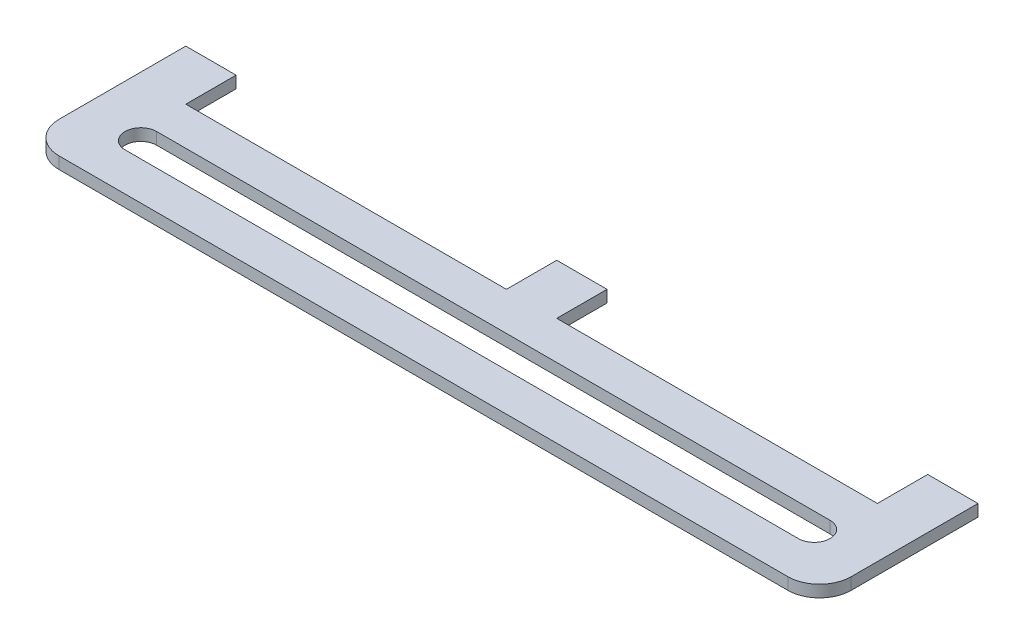
ISO-10303-21;
HEADER;
FILE_DESCRIPTION(('STEP AP214'),'2;1');
FILE_NAME('part.step','',(''),(''),'','','');
FILE_SCHEMA(('AUTOMOTIVE_DESIGN { 1 0 10303 214 1 1 1 1 }'));
ENDSEC;
DATA;
#1=APPLICATION_CONTEXT('core data for automotive mechanical design processes');
#2=APPLICATION_PROTOCOL_DEFINITION('international standard','automotive_design',2000,#1);
#3=PRODUCT_CONTEXT('',#1,'mechanical');
#4=PRODUCT('Part','Part','',(#3));
#5=PRODUCT_RELATED_PRODUCT_CATEGORY('part','',(#4));
#6=PRODUCT_DEFINITION_FORMATION('','',#4);
#7=PRODUCT_DEFINITION_CONTEXT('part definition',#1,'design');
#8=PRODUCT_DEFINITION('design','',#6,#7);
#9=PRODUCT_DEFINITION_SHAPE('','',#8);
#10=(LENGTH_UNIT() NAMED_UNIT(*) SI_UNIT(.MILLI.,.METRE.));
#11=(NAMED_UNIT(*) PLANE_ANGLE_UNIT() SI_UNIT($,.RADIAN.));
#12=(NAMED_UNIT(*) SI_UNIT($,.STERADIAN.) SOLID_ANGLE_UNIT());
#13=UNCERTAINTY_MEASURE_WITH_UNIT(LENGTH_MEASURE(1.E-05),#10,'distance_accuracy_value','');
#14=(GEOMETRIC_REPRESENTATION_CONTEXT(3) GLOBAL_UNCERTAINTY_ASSIGNED_CONTEXT((#13)) GLOBAL_UNIT_ASSIGNED_CONTEXT((#10,
#11,#12)) REPRESENTATION_CONTEXT('',''));
#15=CARTESIAN_POINT('',(0.,0.,0.));
#16=DIRECTION('',(0.,0.,1.));
#17=DIRECTION('',(1.,0.,0.));
#18=AXIS2_PLACEMENT_3D('',#15,#16,#17);
#19=CARTESIAN_POINT('',(85.,3.,6.35000000000005));
#20=DIRECTION('',(0.,-1.,0.));
#21=DIRECTION('',(0.,0.,-1.));
#22=AXIS2_PLACEMENT_3D('',#19,#20,#21);
#23=CYLINDRICAL_SURFACE('',#22,3.99999999999999);
#24=CARTESIAN_POINT('',(85.,0.,6.35000000000005));
#25=DIRECTION('',(0.,1.,0.));
#26=DIRECTION('',(0.,0.,1.));
#27=AXIS2_PLACEMENT_3D('',#24,#25,#26);
#28=CIRCLE('',#27,3.99999999999999);
#29=CARTESIAN_POINT('',(85.,0.,10.35));
#30=VERTEX_POINT('',#29);
#31=CARTESIAN_POINT('',(85.,0.,2.35000000000005));
#32=VERTEX_POINT('',#31);
#33=EDGE_CURVE('E228',#30,#32,#28,.T.);
#34=ORIENTED_EDGE('',*,*,#33,.F.);
#35=DIRECTION('',(0.,-1.,0.));
#36=VECTOR('',#35,1.);
#37=CARTESIAN_POINT('',(85.,3.,10.35));
#38=LINE('',#37,#36);
#39=CARTESIAN_POINT('',(85.,3.,10.35));
#40=VERTEX_POINT('',#39);
#41=EDGE_CURVE('E11',#40,#30,#38,.T.);
#42=ORIENTED_EDGE('',*,*,#41,.F.);
#43=CARTESIAN_POINT('',(85.,3.,6.35000000000005));
#44=DIRECTION('',(0.,1.,0.));
#45=DIRECTION('',(0.,0.,1.));
#46=AXIS2_PLACEMENT_3D('',#43,#44,#45);
#47=CIRCLE('',#46,3.99999999999999);
#48=CARTESIAN_POINT('',(85.,3.,2.35000000000005));
#49=VERTEX_POINT('',#48);
#50=EDGE_CURVE('E182',#40,#49,#47,.T.);
#51=ORIENTED_EDGE('',*,*,#50,.T.);
#52=DIRECTION('',(0.,-1.,0.));
#53=VECTOR('',#52,1.);
#54=CARTESIAN_POINT('',(85.,3.,2.35000000000005));
#55=LINE('',#54,#53);
#56=EDGE_CURVE('E117',#49,#32,#55,.T.);
#57=ORIENTED_EDGE('',*,*,#56,.T.);
#58=EDGE_LOOP('',(#34,#42,#51,#57));
#59=FACE_BOUND('',#58,.T.);
#60=ADVANCED_FACE('F34',(#59),#23,.F.);
#61=CARTESIAN_POINT('',(0.,3.,10.35));
#62=DIRECTION('',(0.,0.,-1.));
#63=DIRECTION('',(-1.,0.,0.));
#64=AXIS2_PLACEMENT_3D('',#61,#62,#63);
#65=PLANE('',#64);
#66=DIRECTION('',(1.,0.,0.));
#67=VECTOR('',#66,1.);
#68=CARTESIAN_POINT('',(0.,0.,10.35));
#69=LINE('',#68,#67);
#70=CARTESIAN_POINT('',(-85.,0.,10.35));
#71=VERTEX_POINT('',#70);
#72=EDGE_CURVE('E174',#71,#30,#69,.T.);
#73=ORIENTED_EDGE('',*,*,#72,.F.);
#74=DIRECTION('',(0.,-1.,0.));
#75=VECTOR('',#74,1.);
#76=CARTESIAN_POINT('',(-85.,3.,10.35));
#77=LINE('',#76,#75);
#78=CARTESIAN_POINT('',(-85.,3.,10.35));
#79=VERTEX_POINT('',#78);
#80=EDGE_CURVE('E44',#79,#71,#77,.T.);
#81=ORIENTED_EDGE('',*,*,#80,.F.);
#82=DIRECTION('',(1.,0.,0.));
#83=VECTOR('',#82,1.);
#84=CARTESIAN_POINT('',(0.,3.,10.35));
#85=LINE('',#84,#83);
#86=EDGE_CURVE('E172',#79,#40,#85,.T.);
#87=ORIENTED_EDGE('',*,*,#86,.T.);
#88=ORIENTED_EDGE('',*,*,#41,.T.);
#89=EDGE_LOOP('',(#73,#81,#87,#88));
#90=FACE_BOUND('',#89,.T.);
#91=ADVANCED_FACE('F171',(#90),#65,.T.);
#92=CARTESIAN_POINT('',(-85.,3.,6.35000000000005));
#93=DIRECTION('',(0.,-1.,0.));
#94=DIRECTION('',(0.,0.,-1.));
#95=AXIS2_PLACEMENT_3D('',#92,#93,#94);
#96=CYLINDRICAL_SURFACE('',#95,4.);
#97=CARTESIAN_POINT('',(-85.,0.,6.35000000000005));
#98=DIRECTION('',(0.,1.,0.));
#99=DIRECTION('',(0.,0.,1.));
#100=AXIS2_PLACEMENT_3D('',#97,#98,#99);
#101=CIRCLE('',#100,4.);
#102=CARTESIAN_POINT('',(-85.,0.,2.35000000000005));
#103=VERTEX_POINT('',#102);
#104=EDGE_CURVE('E232',#103,#71,#101,.T.);
#105=ORIENTED_EDGE('',*,*,#104,.F.);
#106=DIRECTION('',(0.,-1.,0.));
#107=VECTOR('',#106,1.);
#108=CARTESIAN_POINT('',(-85.,3.,2.35000000000005));
#109=LINE('',#108,#107);
#110=CARTESIAN_POINT('',(-85.,3.,2.35000000000005));
#111=VERTEX_POINT('',#110);
#112=EDGE_CURVE('E110',#111,#103,#109,.T.);
#113=ORIENTED_EDGE('',*,*,#112,.F.);
#114=CARTESIAN_POINT('',(-85.,3.,6.35000000000005));
#115=DIRECTION('',(0.,1.,0.));
#116=DIRECTION('',(0.,0.,1.));
#117=AXIS2_PLACEMENT_3D('',#114,#115,#116);
#118=CIRCLE('',#117,4.);
#119=EDGE_CURVE('E181',#111,#79,#118,.T.);
#120=ORIENTED_EDGE('',*,*,#119,.T.);
#121=ORIENTED_EDGE('',*,*,#80,.T.);
#122=EDGE_LOOP('',(#105,#113,#120,#121));
#123=FACE_BOUND('',#122,.T.);
#124=ADVANCED_FACE('F184',(#123),#96,.F.);
#125=CARTESIAN_POINT('',(-92.,3.,12.));
#126=DIRECTION('',(0.,-1.,0.));
#127=DIRECTION('',(0.,0.,-1.));
#128=AXIS2_PLACEMENT_3D('',#125,#126,#127);
#129=CYLINDRICAL_SURFACE('',#128,8.);
#130=CARTESIAN_POINT('',(-92.,0.,12.));
#131=DIRECTION('',(0.,1.,0.));
#132=DIRECTION('',(0.,0.,1.));
#133=AXIS2_PLACEMENT_3D('',#130,#131,#132);
#134=CIRCLE('',#133,8.);
#135=CARTESIAN_POINT('',(-91.9999999999999,0.,20.));
#136=VERTEX_POINT('',#135);
#137=CARTESIAN_POINT('',(-100.,0.,12.));
#138=VERTEX_POINT('',#137);
#139=EDGE_CURVE('E190',#136,#138,#134,.F.);
#140=ORIENTED_EDGE('',*,*,#139,.F.);
#141=DIRECTION('',(0.,-1.,0.));
#142=VECTOR('',#141,1.);
#143=CARTESIAN_POINT('',(-91.9999999999999,3.,20.));
#144=LINE('',#143,#142);
#145=CARTESIAN_POINT('',(-91.9999999999999,3.,20.));
#146=VERTEX_POINT('',#145);
#147=EDGE_CURVE('E38',#146,#136,#144,.T.);
#148=ORIENTED_EDGE('',*,*,#147,.F.);
#149=CARTESIAN_POINT('',(-92.,3.,12.));
#150=DIRECTION('',(0.,1.,0.));
#151=DIRECTION('',(0.,0.,1.));
#152=AXIS2_PLACEMENT_3D('',#149,#150,#151);
#153=CIRCLE('',#152,8.);
#154=CARTESIAN_POINT('',(-100.,3.,12.));
#155=VERTEX_POINT('',#154);
#156=EDGE_CURVE('E236',#146,#155,#153,.F.);
#157=ORIENTED_EDGE('',*,*,#156,.T.);
#158=DIRECTION('',(0.,-1.,0.));
#159=VECTOR('',#158,1.);
#160=CARTESIAN_POINT('',(-100.,3.,12.));
#161=LINE('',#160,#159);
#162=EDGE_CURVE('E186',#155,#138,#161,.T.);
#163=ORIENTED_EDGE('',*,*,#162,.T.);
#164=EDGE_LOOP('',(#140,#148,#157,#163));
#165=FACE_BOUND('',#164,.T.);
#166=ADVANCED_FACE('F36',(#165),#129,.T.);
#167=CARTESIAN_POINT('',(0.,3.,20.));
#168=DIRECTION('',(0.,0.,1.));
#169=DIRECTION('',(1.,0.,0.));
#170=AXIS2_PLACEMENT_3D('',#167,#168,#169);
#171=PLANE('',#170);
#172=DIRECTION('',(-1.,0.,0.));
#173=VECTOR('',#172,1.);
#174=CARTESIAN_POINT('',(0.,0.,20.));
#175=LINE('',#174,#173);
#176=CARTESIAN_POINT('',(92.,0.,20.));
#177=VERTEX_POINT('',#176);
#178=EDGE_CURVE('E193',#177,#136,#175,.T.);
#179=ORIENTED_EDGE('',*,*,#178,.F.);
#180=DIRECTION('',(0.,-1.,0.));
#181=VECTOR('',#180,1.);
#182=CARTESIAN_POINT('',(92.,3.,20.));
#183=LINE('',#182,#181);
#184=CARTESIAN_POINT('',(92.,3.,20.));
#185=VERTEX_POINT('',#184);
#186=EDGE_CURVE('E263',#185,#177,#183,.T.);
#187=ORIENTED_EDGE('',*,*,#186,.F.);
#188=DIRECTION('',(-1.,0.,0.));
#189=VECTOR('',#188,1.);
#190=CARTESIAN_POINT('',(0.,3.,20.));
#191=LINE('',#190,#189);
#192=EDGE_CURVE('E272',#185,#146,#191,.T.);
#193=ORIENTED_EDGE('',*,*,#192,.T.);
#194=ORIENTED_EDGE('',*,*,#147,.T.);
#195=EDGE_LOOP('',(#179,#187,#193,#194));
#196=FACE_BOUND('',#195,.T.);
#197=ADVANCED_FACE('F270',(#196),#171,.T.);
#198=CARTESIAN_POINT('',(92.,3.,12.));
#199=DIRECTION('',(0.,-1.,0.));
#200=DIRECTION('',(0.,0.,-1.));
#201=AXIS2_PLACEMENT_3D('',#198,#199,#200);
#202=CYLINDRICAL_SURFACE('',#201,8.);
#203=CARTESIAN_POINT('',(92.,0.,12.));
#204=DIRECTION('',(0.,1.,0.));
#205=DIRECTION('',(0.,0.,1.));
#206=AXIS2_PLACEMENT_3D('',#203,#204,#205);
#207=CIRCLE('',#206,8.);
#208=CARTESIAN_POINT('',(100.,0.,11.9999999999999));
#209=VERTEX_POINT('',#208);
#210=EDGE_CURVE('E196',#209,#177,#207,.F.);
#211=ORIENTED_EDGE('',*,*,#210,.F.);
#212=DIRECTION('',(0.,-1.,0.));
#213=VECTOR('',#212,1.);
#214=CARTESIAN_POINT('',(100.,3.,11.9999999999999));
#215=LINE('',#214,#213);
#216=CARTESIAN_POINT('',(100.,3.,11.9999999999999));
#217=VERTEX_POINT('',#216);
#218=EDGE_CURVE('E262',#217,#209,#215,.T.);
#219=ORIENTED_EDGE('',*,*,#218,.F.);
#220=CARTESIAN_POINT('',(92.,3.,12.));
#221=DIRECTION('',(0.,1.,0.));
#222=DIRECTION('',(0.,0.,1.));
#223=AXIS2_PLACEMENT_3D('',#220,#221,#222);
#224=CIRCLE('',#223,8.);
#225=EDGE_CURVE('E282',#217,#185,#224,.F.);
#226=ORIENTED_EDGE('',*,*,#225,.T.);
#227=ORIENTED_EDGE('',*,*,#186,.T.);
#228=EDGE_LOOP('',(#211,#219,#226,#227));
#229=FACE_BOUND('',#228,.T.);
#230=ADVANCED_FACE('F279',(#229),#202,.T.);
#231=CARTESIAN_POINT('',(100.,3.,0.));
#232=DIRECTION('',(-1.,0.,0.));
#233=DIRECTION('',(0.,0.,1.));
#234=AXIS2_PLACEMENT_3D('',#231,#232,#233);
#235=PLANE('',#234);
#236=DIRECTION('',(0.,0.,-1.));
#237=VECTOR('',#236,1.);
#238=CARTESIAN_POINT('',(100.,0.,0.));
#239=LINE('',#238,#237);
#240=CARTESIAN_POINT('',(100.,0.,-20.));
#241=VERTEX_POINT('',#240);
#242=EDGE_CURVE('E199',#209,#241,#239,.T.);
#243=ORIENTED_EDGE('',*,*,#242,.T.);
#244=DIRECTION('',(0.,-1.,0.));
#245=VECTOR('',#244,1.);
#246=CARTESIAN_POINT('',(100.,3.,-20.));
#247=LINE('',#246,#245);
#248=CARTESIAN_POINT('',(100.,3.,-20.));
#249=VERTEX_POINT('',#248);
#250=EDGE_CURVE('E259',#249,#241,#247,.T.);
#251=ORIENTED_EDGE('',*,*,#250,.F.);
#252=DIRECTION('',(0.,0.,-1.));
#253=VECTOR('',#252,1.);
#254=CARTESIAN_POINT('',(100.,3.,0.));
#255=LINE('',#254,#253);
#256=EDGE_CURVE('E285',#217,#249,#255,.T.);
#257=ORIENTED_EDGE('',*,*,#256,.F.);
#258=ORIENTED_EDGE('',*,*,#218,.T.);
#259=EDGE_LOOP('',(#243,#251,#257,#258));
#260=FACE_BOUND('',#259,.T.);
#261=ADVANCED_FACE('F286',(#260),#235,.F.);
#262=CARTESIAN_POINT('',(-1.47519791657865E-13,3.,-19.9999999999993));
#263=DIRECTION('',(0.,0.,1.));
#264=DIRECTION('',(1.,0.,0.));
#265=AXIS2_PLACEMENT_3D('',#262,#263,#264);
#266=PLANE('',#265);
#267=DIRECTION('',(-1.,0.,0.));
#268=VECTOR('',#267,1.);
#269=CARTESIAN_POINT('',(-1.47519791657865E-13,0.,-19.9999999999993));
#270=LINE('',#269,#268);
#271=CARTESIAN_POINT('',(87.3,0.,-20.));
#272=VERTEX_POINT('',#271);
#273=EDGE_CURVE('E201',#241,#272,#270,.T.);
#274=ORIENTED_EDGE('',*,*,#273,.T.);
#275=DIRECTION('',(0.,-1.,0.));
#276=VECTOR('',#275,1.);
#277=CARTESIAN_POINT('',(87.3,3.,-20.));
#278=LINE('',#277,#276);
#279=CARTESIAN_POINT('',(87.3,3.,-20.));
#280=VERTEX_POINT('',#279);
#281=EDGE_CURVE('E256',#280,#272,#278,.T.);
#282=ORIENTED_EDGE('',*,*,#281,.F.);
#283=DIRECTION('',(-1.,0.,0.));
#284=VECTOR('',#283,1.);
#285=CARTESIAN_POINT('',(-1.47519791657865E-13,3.,-19.9999999999993));
#286=LINE('',#285,#284);
#287=EDGE_CURVE('E289',#249,#280,#286,.T.);
#288=ORIENTED_EDGE('',*,*,#287,.F.);
#289=ORIENTED_EDGE('',*,*,#250,.T.);
#290=EDGE_LOOP('',(#274,#282,#288,#289));
#291=FACE_BOUND('',#290,.T.);
#292=ADVANCED_FACE('F365',(#291),#266,.F.);
#293=CARTESIAN_POINT('',(87.3,3.,0.));
#294=DIRECTION('',(1.,0.,0.));
#295=DIRECTION('',(0.,0.,-1.));
#296=AXIS2_PLACEMENT_3D('',#293,#294,#295);
#297=PLANE('',#296);
#298=DIRECTION('',(0.,0.,1.));
#299=VECTOR('',#298,1.);
#300=CARTESIAN_POINT('',(87.3,0.,0.));
#301=LINE('',#300,#299);
#302=CARTESIAN_POINT('',(87.3,0.,-7.29999999999996));
#303=VERTEX_POINT('',#302);
#304=EDGE_CURVE('E203',#272,#303,#301,.T.);
#305=ORIENTED_EDGE('',*,*,#304,.T.);
#306=DIRECTION('',(0.,-1.,0.));
#307=VECTOR('',#306,1.);
#308=CARTESIAN_POINT('',(87.3,3.,-7.29999999999996));
#309=LINE('',#308,#307);
#310=CARTESIAN_POINT('',(87.3,3.,-7.29999999999996));
#311=VERTEX_POINT('',#310);
#312=EDGE_CURVE('E254',#311,#303,#309,.T.);
#313=ORIENTED_EDGE('',*,*,#312,.F.);
#314=DIRECTION('',(0.,0.,1.));
#315=VECTOR('',#314,1.);
#316=CARTESIAN_POINT('',(87.3,3.,0.));
#317=LINE('',#316,#315);
#318=EDGE_CURVE('E296',#280,#311,#317,.T.);
#319=ORIENTED_EDGE('',*,*,#318,.F.);
#320=ORIENTED_EDGE('',*,*,#281,.T.);
#321=EDGE_LOOP('',(#305,#313,#319,#320));
#322=FACE_BOUND('',#321,.T.);
#323=ADVANCED_FACE('F362',(#322),#297,.F.);
#324=CARTESIAN_POINT('',(0.,3.,-7.29999999999996));
#325=DIRECTION('',(0.,0.,-1.));
#326=DIRECTION('',(-1.,0.,0.));
#327=AXIS2_PLACEMENT_3D('',#324,#325,#326);
#328=PLANE('',#327);
#329=DIRECTION('',(1.,0.,0.));
#330=VECTOR('',#329,1.);
#331=CARTESIAN_POINT('',(0.,0.,-7.29999999999996));
#332=LINE('',#331,#330);
#333=CARTESIAN_POINT('',(6.35,0.,-7.29999999999996));
#334=VERTEX_POINT('',#333);
#335=EDGE_CURVE('E206',#334,#303,#332,.T.);
#336=ORIENTED_EDGE('',*,*,#335,.F.);
#337=DIRECTION('',(0.,-1.,0.));
#338=VECTOR('',#337,1.);
#339=CARTESIAN_POINT('',(6.35,3.,-7.29999999999996));
#340=LINE('',#339,#338);
#341=CARTESIAN_POINT('',(6.35,3.,-7.29999999999996));
#342=VERTEX_POINT('',#341);
#343=EDGE_CURVE('E252',#342,#334,#340,.T.);
#344=ORIENTED_EDGE('',*,*,#343,.F.);
#345=DIRECTION('',(1.,0.,0.));
#346=VECTOR('',#345,1.);
#347=CARTESIAN_POINT('',(0.,3.,-7.29999999999996));
#348=LINE('',#347,#346);
#349=EDGE_CURVE('E298',#342,#311,#348,.T.);
#350=ORIENTED_EDGE('',*,*,#349,.T.);
#351=ORIENTED_EDGE('',*,*,#312,.T.);
#352=EDGE_LOOP('',(#336,#344,#350,#351));
#353=FACE_BOUND('',#352,.T.);
#354=ADVANCED_FACE('F350',(#353),#328,.T.);
#355=CARTESIAN_POINT('',(6.35,3.,0.));
#356=DIRECTION('',(1.,0.,0.));
#357=DIRECTION('',(0.,0.,-1.));
#358=AXIS2_PLACEMENT_3D('',#355,#356,#357);
#359=PLANE('',#358);
#360=DIRECTION('',(0.,0.,1.));
#361=VECTOR('',#360,1.);
#362=CARTESIAN_POINT('',(6.35,0.,0.));
#363=LINE('',#362,#361);
#364=CARTESIAN_POINT('',(6.35,0.,-20.));
#365=VERTEX_POINT('',#364);
#366=EDGE_CURVE('E209',#365,#334,#363,.T.);
#367=ORIENTED_EDGE('',*,*,#366,.F.);
#368=DIRECTION('',(0.,-1.,0.));
#369=VECTOR('',#368,1.);
#370=CARTESIAN_POINT('',(6.35,3.,-20.));
#371=LINE('',#370,#369);
#372=CARTESIAN_POINT('',(6.35,3.,-20.));
#373=VERTEX_POINT('',#372);
#374=EDGE_CURVE('E250',#373,#365,#371,.T.);
#375=ORIENTED_EDGE('',*,*,#374,.F.);
#376=DIRECTION('',(0.,0.,1.));
#377=VECTOR('',#376,1.);
#378=CARTESIAN_POINT('',(6.35,3.,0.));
#379=LINE('',#378,#377);
#380=EDGE_CURVE('E301',#373,#342,#379,.T.);
#381=ORIENTED_EDGE('',*,*,#380,.T.);
#382=ORIENTED_EDGE('',*,*,#343,.T.);
#383=EDGE_LOOP('',(#367,#375,#381,#382));
#384=FACE_BOUND('',#383,.T.);
#385=ADVANCED_FACE('F357',(#384),#359,.T.);
#386=CARTESIAN_POINT('',(0.,3.,-20.));
#387=DIRECTION('',(0.,0.,-1.));
#388=DIRECTION('',(-1.,0.,0.));
#389=AXIS2_PLACEMENT_3D('',#386,#387,#388);
#390=PLANE('',#389);
#391=DIRECTION('',(1.,0.,0.));
#392=VECTOR('',#391,1.);
#393=CARTESIAN_POINT('',(0.,0.,-20.));
#394=LINE('',#393,#392);
#395=CARTESIAN_POINT('',(-6.35,0.,-20.));
#396=VERTEX_POINT('',#395);
#397=EDGE_CURVE('E213',#396,#365,#394,.T.);
#398=ORIENTED_EDGE('',*,*,#397,.F.);
#399=DIRECTION('',(0.,-1.,0.));
#400=VECTOR('',#399,1.);
#401=CARTESIAN_POINT('',(-6.35,3.,-20.));
#402=LINE('',#401,#400);
#403=CARTESIAN_POINT('',(-6.35,3.,-20.));
#404=VERTEX_POINT('',#403);
#405=EDGE_CURVE('E248',#404,#396,#402,.T.);
#406=ORIENTED_EDGE('',*,*,#405,.F.);
#407=DIRECTION('',(1.,0.,0.));
#408=VECTOR('',#407,1.);
#409=CARTESIAN_POINT('',(0.,3.,-20.));
#410=LINE('',#409,#408);
#411=EDGE_CURVE('E305',#404,#373,#410,.T.);
#412=ORIENTED_EDGE('',*,*,#411,.T.);
#413=ORIENTED_EDGE('',*,*,#374,.T.);
#414=EDGE_LOOP('',(#398,#406,#412,#413));
#415=FACE_BOUND('',#414,.T.);
#416=ADVANCED_FACE('F353',(#415),#390,.T.);
#417=CARTESIAN_POINT('',(-6.35,3.,0.));
#418=DIRECTION('',(1.,0.,0.));
#419=DIRECTION('',(0.,0.,-1.));
#420=AXIS2_PLACEMENT_3D('',#417,#418,#419);
#421=PLANE('',#420);
#422=DIRECTION('',(0.,0.,1.));
#423=VECTOR('',#422,1.);
#424=CARTESIAN_POINT('',(-6.35,0.,0.));
#425=LINE('',#424,#423);
#426=CARTESIAN_POINT('',(-6.35,0.,-7.29999999999996));
#427=VERTEX_POINT('',#426);
#428=EDGE_CURVE('E216',#396,#427,#425,.T.);
#429=ORIENTED_EDGE('',*,*,#428,.T.);
#430=DIRECTION('',(0.,-1.,0.));
#431=VECTOR('',#430,1.);
#432=CARTESIAN_POINT('',(-6.35,3.,-7.29999999999996));
#433=LINE('',#432,#431);
#434=CARTESIAN_POINT('',(-6.35,3.,-7.29999999999996));
#435=VERTEX_POINT('',#434);
#436=EDGE_CURVE('E246',#435,#427,#433,.T.);
#437=ORIENTED_EDGE('',*,*,#436,.F.);
#438=DIRECTION('',(0.,0.,1.));
#439=VECTOR('',#438,1.);
#440=CARTESIAN_POINT('',(-6.35,3.,0.));
#441=LINE('',#440,#439);
#442=EDGE_CURVE('E308',#404,#435,#441,.T.);
#443=ORIENTED_EDGE('',*,*,#442,.F.);
#444=ORIENTED_EDGE('',*,*,#405,.T.);
#445=EDGE_LOOP('',(#429,#437,#443,#444));
#446=FACE_BOUND('',#445,.T.);
#447=ADVANCED_FACE('F348',(#446),#421,.F.);
#448=CARTESIAN_POINT('',(-87.3,0.,-7.29999999999996));
#449=VERTEX_POINT('',#448);
#450=EDGE_CURVE('E210',#449,#427,#332,.T.);
#451=ORIENTED_EDGE('',*,*,#450,.F.);
#452=DIRECTION('',(0.,-1.,0.));
#453=VECTOR('',#452,1.);
#454=CARTESIAN_POINT('',(-87.3,3.,-7.29999999999996));
#455=LINE('',#454,#453);
#456=CARTESIAN_POINT('',(-87.3,3.,-7.29999999999996));
#457=VERTEX_POINT('',#456);
#458=EDGE_CURVE('E244',#457,#449,#455,.T.);
#459=ORIENTED_EDGE('',*,*,#458,.F.);
#460=EDGE_CURVE('E302',#457,#435,#348,.T.);
#461=ORIENTED_EDGE('',*,*,#460,.T.);
#462=ORIENTED_EDGE('',*,*,#436,.T.);
#463=EDGE_LOOP('',(#451,#459,#461,#462));
#464=FACE_BOUND('',#463,.T.);
#465=ADVANCED_FACE('F344',(#464),#328,.T.);
#466=CARTESIAN_POINT('',(-87.3,3.,0.));
#467=DIRECTION('',(1.,0.,0.));
#468=DIRECTION('',(0.,0.,-1.));
#469=AXIS2_PLACEMENT_3D('',#466,#467,#468);
#470=PLANE('',#469);
#471=DIRECTION('',(0.,0.,1.));
#472=VECTOR('',#471,1.);
#473=CARTESIAN_POINT('',(-87.3,0.,0.));
#474=LINE('',#473,#472);
#475=CARTESIAN_POINT('',(-87.3,0.,-20.));
#476=VERTEX_POINT('',#475);
#477=EDGE_CURVE('E219',#476,#449,#474,.T.);
#478=ORIENTED_EDGE('',*,*,#477,.F.);
#479=DIRECTION('',(0.,-1.,0.));
#480=VECTOR('',#479,1.);
#481=CARTESIAN_POINT('',(-87.3,3.,-20.));
#482=LINE('',#481,#480);
#483=CARTESIAN_POINT('',(-87.3,3.,-20.));
#484=VERTEX_POINT('',#483);
#485=EDGE_CURVE('E242',#484,#476,#482,.T.);
#486=ORIENTED_EDGE('',*,*,#485,.F.);
#487=DIRECTION('',(0.,0.,1.));
#488=VECTOR('',#487,1.);
#489=CARTESIAN_POINT('',(-87.3,3.,0.));
#490=LINE('',#489,#488);
#491=EDGE_CURVE('E310',#484,#457,#490,.T.);
#492=ORIENTED_EDGE('',*,*,#491,.T.);
#493=ORIENTED_EDGE('',*,*,#458,.T.);
#494=EDGE_LOOP('',(#478,#486,#492,#493));
#495=FACE_BOUND('',#494,.T.);
#496=ADVANCED_FACE('F340',(#495),#470,.T.);
#497=CARTESIAN_POINT('',(0.,3.,-20.));
#498=DIRECTION('',(0.,0.,1.));
#499=DIRECTION('',(1.,0.,0.));
#500=AXIS2_PLACEMENT_3D('',#497,#498,#499);
#501=PLANE('',#500);
#502=DIRECTION('',(-1.,0.,0.));
#503=VECTOR('',#502,1.);
#504=CARTESIAN_POINT('',(0.,0.,-20.));
#505=LINE('',#504,#503);
#506=CARTESIAN_POINT('',(-100.,0.,-20.));
#507=VERTEX_POINT('',#506);
#508=EDGE_CURVE('E222',#476,#507,#505,.T.);
#509=ORIENTED_EDGE('',*,*,#508,.T.);
#510=DIRECTION('',(0.,-1.,0.));
#511=VECTOR('',#510,1.);
#512=CARTESIAN_POINT('',(-100.,3.,-20.));
#513=LINE('',#512,#511);
#514=CARTESIAN_POINT('',(-100.,3.,-20.));
#515=VERTEX_POINT('',#514);
#516=EDGE_CURVE('E240',#515,#507,#513,.T.);
#517=ORIENTED_EDGE('',*,*,#516,.F.);
#518=DIRECTION('',(-1.,0.,0.));
#519=VECTOR('',#518,1.);
#520=CARTESIAN_POINT('',(0.,3.,-20.));
#521=LINE('',#520,#519);
#522=EDGE_CURVE('E313',#484,#515,#521,.T.);
#523=ORIENTED_EDGE('',*,*,#522,.F.);
#524=ORIENTED_EDGE('',*,*,#485,.T.);
#525=EDGE_LOOP('',(#509,#517,#523,#524));
#526=FACE_BOUND('',#525,.T.);
#527=ADVANCED_FACE('F326',(#526),#501,.F.);
#528=CARTESIAN_POINT('',(-100.,3.,0.));
#529=DIRECTION('',(-1.,0.,0.));
#530=DIRECTION('',(0.,0.,1.));
#531=AXIS2_PLACEMENT_3D('',#528,#529,#530);
#532=PLANE('',#531);
#533=DIRECTION('',(0.,0.,-1.));
#534=VECTOR('',#533,1.);
#535=CARTESIAN_POINT('',(-100.,0.,0.));
#536=LINE('',#535,#534);
#537=EDGE_CURVE('E225',#138,#507,#536,.T.);
#538=ORIENTED_EDGE('',*,*,#537,.F.);
#539=ORIENTED_EDGE('',*,*,#162,.F.);
#540=DIRECTION('',(0.,0.,-1.));
#541=VECTOR('',#540,1.);
#542=CARTESIAN_POINT('',(-100.,3.,0.));
#543=LINE('',#542,#541);
#544=EDGE_CURVE('E315',#155,#515,#543,.T.);
#545=ORIENTED_EDGE('',*,*,#544,.T.);
#546=ORIENTED_EDGE('',*,*,#516,.T.);
#547=EDGE_LOOP('',(#538,#539,#545,#546));
#548=FACE_BOUND('',#547,.T.);
#549=ADVANCED_FACE('F319',(#548),#532,.T.);
#550=CARTESIAN_POINT('',(0.,3.,2.35000000000005));
#551=DIRECTION('',(0.,0.,-1.));
#552=DIRECTION('',(-1.,0.,0.));
#553=AXIS2_PLACEMENT_3D('',#550,#551,#552);
#554=PLANE('',#553);
#555=DIRECTION('',(1.,0.,0.));
#556=VECTOR('',#555,1.);
#557=CARTESIAN_POINT('',(0.,0.,2.35000000000005));
#558=LINE('',#557,#556);
#559=EDGE_CURVE('E234',#103,#32,#558,.T.);
#560=ORIENTED_EDGE('',*,*,#559,.T.);
#561=ORIENTED_EDGE('',*,*,#56,.F.);
#562=DIRECTION('',(1.,0.,0.));
#563=VECTOR('',#562,1.);
#564=CARTESIAN_POINT('',(0.,3.,2.35000000000005));
#565=LINE('',#564,#563);
#566=EDGE_CURVE('E53',#111,#49,#565,.T.);
#567=ORIENTED_EDGE('',*,*,#566,.F.);
#568=ORIENTED_EDGE('',*,*,#112,.T.);
#569=EDGE_LOOP('',(#560,#561,#567,#568));
#570=FACE_BOUND('',#569,.T.);
#571=ADVANCED_FACE('F317',(#570),#554,.F.);
#572=CARTESIAN_POINT('',(0.,3.,0.));
#573=DIRECTION('',(0.,1.,0.));
#574=DIRECTION('',(0.,0.,1.));
#575=AXIS2_PLACEMENT_3D('',#572,#573,#574);
#576=PLANE('',#575);
#577=ORIENTED_EDGE('',*,*,#156,.F.);
#578=ORIENTED_EDGE('',*,*,#192,.F.);
#579=ORIENTED_EDGE('',*,*,#225,.F.);
#580=ORIENTED_EDGE('',*,*,#256,.T.);
#581=ORIENTED_EDGE('',*,*,#287,.T.);
#582=ORIENTED_EDGE('',*,*,#318,.T.);
#583=ORIENTED_EDGE('',*,*,#349,.F.);
#584=ORIENTED_EDGE('',*,*,#380,.F.);
#585=ORIENTED_EDGE('',*,*,#411,.F.);
#586=ORIENTED_EDGE('',*,*,#442,.T.);
#587=ORIENTED_EDGE('',*,*,#460,.F.);
#588=ORIENTED_EDGE('',*,*,#491,.F.);
#589=ORIENTED_EDGE('',*,*,#522,.T.);
#590=ORIENTED_EDGE('',*,*,#544,.F.);
#591=EDGE_LOOP('',(#577,#578,#579,#580,#581,#582,#583,#584,#585,#586,#587,#588,#589,#590));
#592=FACE_BOUND('',#591,.T.);
#593=ORIENTED_EDGE('',*,*,#50,.F.);
#594=ORIENTED_EDGE('',*,*,#86,.F.);
#595=ORIENTED_EDGE('',*,*,#119,.F.);
#596=ORIENTED_EDGE('',*,*,#566,.T.);
#597=EDGE_LOOP('',(#593,#594,#595,#596));
#598=FACE_BOUND('',#597,.T.);
#599=ADVANCED_FACE('F180',(#592,#598),#576,.T.);
#600=CARTESIAN_POINT('',(0.,0.,0.));
#601=DIRECTION('',(0.,1.,0.));
#602=DIRECTION('',(0.,0.,1.));
#603=AXIS2_PLACEMENT_3D('',#600,#601,#602);
#604=PLANE('',#603);
#605=ORIENTED_EDGE('',*,*,#139,.T.);
#606=ORIENTED_EDGE('',*,*,#537,.T.);
#607=ORIENTED_EDGE('',*,*,#508,.F.);
#608=ORIENTED_EDGE('',*,*,#477,.T.);
#609=ORIENTED_EDGE('',*,*,#450,.T.);
#610=ORIENTED_EDGE('',*,*,#428,.F.);
#611=ORIENTED_EDGE('',*,*,#397,.T.);
#612=ORIENTED_EDGE('',*,*,#366,.T.);
#613=ORIENTED_EDGE('',*,*,#335,.T.);
#614=ORIENTED_EDGE('',*,*,#304,.F.);
#615=ORIENTED_EDGE('',*,*,#273,.F.);
#616=ORIENTED_EDGE('',*,*,#242,.F.);
#617=ORIENTED_EDGE('',*,*,#210,.T.);
#618=ORIENTED_EDGE('',*,*,#178,.T.);
#619=EDGE_LOOP('',(#605,#606,#607,#608,#609,#610,#611,#612,#613,#614,#615,#616,#617,#618));
#620=FACE_BOUND('',#619,.T.);
#621=ORIENTED_EDGE('',*,*,#33,.T.);
#622=ORIENTED_EDGE('',*,*,#559,.F.);
#623=ORIENTED_EDGE('',*,*,#104,.T.);
#624=ORIENTED_EDGE('',*,*,#72,.T.);
#625=EDGE_LOOP('',(#621,#622,#623,#624));
#626=FACE_BOUND('',#625,.T.);
#627=ADVANCED_FACE('F275',(#620,#626),#604,.F.);
#628=CLOSED_SHELL('',(#60,#91,#124,#166,#197,#230,#261,#292,#323,#354,#385,#416,#447,#465,#496,
#527,#549,#571,#599,#627));
#629=MANIFOLD_SOLID_BREP('B2',#628);
#630=ADVANCED_BREP_SHAPE_REPRESENTATION('',(#18,#629),#14);
#631=SHAPE_DEFINITION_REPRESENTATION(#9,#630);
ENDSEC;
END-ISO-10303-21;
